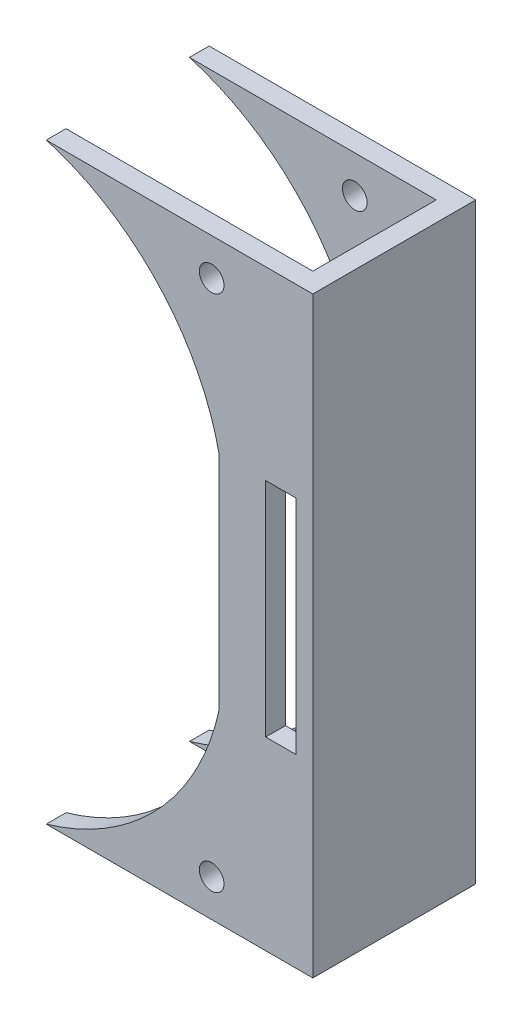
ISO-10303-21;
HEADER;
FILE_DESCRIPTION(('STEP AP214'),'2;1');
FILE_NAME('part.step','',(''),(''),'','','');
FILE_SCHEMA(('AUTOMOTIVE_DESIGN { 1 0 10303 214 1 1 1 1 }'));
ENDSEC;
DATA;
#1=APPLICATION_CONTEXT('core data for automotive mechanical design processes');
#2=APPLICATION_PROTOCOL_DEFINITION('international standard','automotive_design',2000,#1);
#3=PRODUCT_CONTEXT('',#1,'mechanical');
#4=PRODUCT('Part','Part','',(#3));
#5=PRODUCT_RELATED_PRODUCT_CATEGORY('part','',(#4));
#6=PRODUCT_DEFINITION_FORMATION('','',#4);
#7=PRODUCT_DEFINITION_CONTEXT('part definition',#1,'design');
#8=PRODUCT_DEFINITION('design','',#6,#7);
#9=PRODUCT_DEFINITION_SHAPE('','',#8);
#10=(LENGTH_UNIT() NAMED_UNIT(*) SI_UNIT(.MILLI.,.METRE.));
#11=(NAMED_UNIT(*) PLANE_ANGLE_UNIT() SI_UNIT($,.RADIAN.));
#12=(NAMED_UNIT(*) SI_UNIT($,.STERADIAN.) SOLID_ANGLE_UNIT());
#13=UNCERTAINTY_MEASURE_WITH_UNIT(LENGTH_MEASURE(1.E-05),#10,'distance_accuracy_value','');
#14=(GEOMETRIC_REPRESENTATION_CONTEXT(3) GLOBAL_UNCERTAINTY_ASSIGNED_CONTEXT((#13)) GLOBAL_UNIT_ASSIGNED_CONTEXT((#10,
#11,#12)) REPRESENTATION_CONTEXT('',''));
#15=CARTESIAN_POINT('',(0.,0.,0.));
#16=DIRECTION('',(0.,0.,1.));
#17=DIRECTION('',(1.,0.,0.));
#18=AXIS2_PLACEMENT_3D('',#15,#16,#17);
#19=CARTESIAN_POINT('',(27.3357664233577,0.,0.));
#20=DIRECTION('',(1.,0.,0.));
#21=DIRECTION('',(0.,1.,0.));
#22=AXIS2_PLACEMENT_3D('',#19,#20,#21);
#23=PLANE('',#22);
#24=DIRECTION('',(0.,-1.,0.));
#25=VECTOR('',#24,1.);
#26=CARTESIAN_POINT('',(27.3357664233577,0.,0.));
#27=LINE('',#26,#25);
#28=CARTESIAN_POINT('',(27.3357664233577,-22.5,0.));
#29=VERTEX_POINT('',#28);
#30=CARTESIAN_POINT('',(27.3357664233577,-60.,0.));
#31=VERTEX_POINT('',#30);
#32=EDGE_CURVE('E323',#29,#31,#27,.T.);
#33=ORIENTED_EDGE('',*,*,#32,.F.);
#34=DIRECTION('',(0.,0.,-1.));
#35=VECTOR('',#34,1.);
#36=CARTESIAN_POINT('',(27.3357664233577,-22.5,0.));
#37=LINE('',#36,#35);
#38=CARTESIAN_POINT('',(27.3357664233577,-22.5,-25.));
#39=VERTEX_POINT('',#38);
#40=EDGE_CURVE('E223',#29,#39,#37,.T.);
#41=ORIENTED_EDGE('',*,*,#40,.T.);
#42=DIRECTION('',(0.,-1.,0.));
#43=VECTOR('',#42,1.);
#44=CARTESIAN_POINT('',(27.3357664233577,0.,-25.));
#45=LINE('',#44,#43);
#46=CARTESIAN_POINT('',(27.3357664233577,-60.,-25.));
#47=VERTEX_POINT('',#46);
#48=EDGE_CURVE('E262',#39,#47,#45,.T.);
#49=ORIENTED_EDGE('',*,*,#48,.T.);
#50=DIRECTION('',(0.,0.,-1.));
#51=VECTOR('',#50,1.);
#52=CARTESIAN_POINT('',(27.3357664233577,-60.,4.));
#53=LINE('',#52,#51);
#54=EDGE_CURVE('E286',#31,#47,#53,.T.);
#55=ORIENTED_EDGE('',*,*,#54,.F.);
#56=EDGE_LOOP('',(#33,#41,#49,#55));
#57=FACE_BOUND('',#56,.T.);
#58=ADVANCED_FACE('F37',(#57),#23,.F.);
#59=CARTESIAN_POINT('',(27.3357664233576,60.,-25.));
#60=VERTEX_POINT('',#59);
#61=CARTESIAN_POINT('',(27.3357664233576,22.5,-25.));
#62=VERTEX_POINT('',#61);
#63=EDGE_CURVE('E263',#60,#62,#45,.T.);
#64=ORIENTED_EDGE('',*,*,#63,.T.);
#65=DIRECTION('',(0.,0.,1.));
#66=VECTOR('',#65,1.);
#67=CARTESIAN_POINT('',(27.3357664233576,22.5,0.));
#68=LINE('',#67,#66);
#69=CARTESIAN_POINT('',(27.3357664233576,22.5,0.));
#70=VERTEX_POINT('',#69);
#71=EDGE_CURVE('E209',#62,#70,#68,.T.);
#72=ORIENTED_EDGE('',*,*,#71,.T.);
#73=CARTESIAN_POINT('',(27.3357664233576,60.,0.));
#74=VERTEX_POINT('',#73);
#75=EDGE_CURVE('E324',#74,#70,#27,.T.);
#76=ORIENTED_EDGE('',*,*,#75,.F.);
#77=DIRECTION('',(0.,0.,1.));
#78=VECTOR('',#77,1.);
#79=CARTESIAN_POINT('',(27.3357664233576,60.,4.));
#80=LINE('',#79,#78);
#81=EDGE_CURVE('E291',#60,#74,#80,.T.);
#82=ORIENTED_EDGE('',*,*,#81,.F.);
#83=EDGE_LOOP('',(#64,#72,#76,#82));
#84=FACE_BOUND('',#83,.T.);
#85=ADVANCED_FACE('F372',(#84),#23,.F.);
#86=CARTESIAN_POINT('',(0.,-60.,4.));
#87=DIRECTION('',(0.,-1.,0.));
#88=DIRECTION('',(0.,0.,-1.));
#89=AXIS2_PLACEMENT_3D('',#86,#87,#88);
#90=PLANE('',#89);
#91=DIRECTION('',(-1.,0.,0.));
#92=VECTOR('',#91,1.);
#93=CARTESIAN_POINT('',(0.,-60.,0.));
#94=LINE('',#93,#92);
#95=CARTESIAN_POINT('',(-22.6642335766423,-60.,0.));
#96=VERTEX_POINT('',#95);
#97=EDGE_CURVE('E305',#31,#96,#94,.T.);
#98=ORIENTED_EDGE('',*,*,#97,.F.);
#99=ORIENTED_EDGE('',*,*,#54,.T.);
#100=DIRECTION('',(-1.,0.,0.));
#101=VECTOR('',#100,1.);
#102=CARTESIAN_POINT('',(0.,-60.,-25.));
#103=LINE('',#102,#101);
#104=CARTESIAN_POINT('',(-22.6642335766423,-60.,-25.));
#105=VERTEX_POINT('',#104);
#106=EDGE_CURVE('E249',#47,#105,#103,.T.);
#107=ORIENTED_EDGE('',*,*,#106,.T.);
#108=DIRECTION('',(0.,0.,1.));
#109=VECTOR('',#108,1.);
#110=CARTESIAN_POINT('',(-22.6642335766423,-60.,-29.));
#111=LINE('',#110,#109);
#112=CARTESIAN_POINT('',(-22.6642335766423,-60.,-29.));
#113=VERTEX_POINT('',#112);
#114=EDGE_CURVE('E259',#113,#105,#111,.T.);
#115=ORIENTED_EDGE('',*,*,#114,.F.);
#116=DIRECTION('',(-1.,0.,0.));
#117=VECTOR('',#116,1.);
#118=CARTESIAN_POINT('',(31.3357664233577,-60.,-29.));
#119=LINE('',#118,#117);
#120=CARTESIAN_POINT('',(31.3357664233577,-60.,-29.));
#121=VERTEX_POINT('',#120);
#122=EDGE_CURVE('E303',#121,#113,#119,.T.);
#123=ORIENTED_EDGE('',*,*,#122,.F.);
#124=DIRECTION('',(0.,0.,-1.));
#125=VECTOR('',#124,1.);
#126=CARTESIAN_POINT('',(31.3357664233577,-60.,4.));
#127=LINE('',#126,#125);
#128=CARTESIAN_POINT('',(31.3357664233577,-60.,4.));
#129=VERTEX_POINT('',#128);
#130=EDGE_CURVE('E290',#129,#121,#127,.T.);
#131=ORIENTED_EDGE('',*,*,#130,.F.);
#132=DIRECTION('',(-1.,0.,0.));
#133=VECTOR('',#132,1.);
#134=CARTESIAN_POINT('',(0.,-60.,4.));
#135=LINE('',#134,#133);
#136=CARTESIAN_POINT('',(-22.6642335766423,-60.,4.));
#137=VERTEX_POINT('',#136);
#138=EDGE_CURVE('E306',#129,#137,#135,.T.);
#139=ORIENTED_EDGE('',*,*,#138,.T.);
#140=DIRECTION('',(0.,0.,-1.));
#141=VECTOR('',#140,1.);
#142=CARTESIAN_POINT('',(-22.6642335766423,-60.,4.));
#143=LINE('',#142,#141);
#144=EDGE_CURVE('E320',#137,#96,#143,.T.);
#145=ORIENTED_EDGE('',*,*,#144,.T.);
#146=EDGE_LOOP('',(#98,#99,#107,#115,#123,#131,#139,#145));
#147=FACE_BOUND('',#146,.T.);
#148=ADVANCED_FACE('F39',(#147),#90,.T.);
#149=CARTESIAN_POINT('',(0.,60.,4.));
#150=DIRECTION('',(0.,1.,0.));
#151=DIRECTION('',(0.,0.,1.));
#152=AXIS2_PLACEMENT_3D('',#149,#150,#151);
#153=PLANE('',#152);
#154=DIRECTION('',(1.,0.,0.));
#155=VECTOR('',#154,1.);
#156=CARTESIAN_POINT('',(0.,60.,0.));
#157=LINE('',#156,#155);
#158=CARTESIAN_POINT('',(-22.6642335766424,60.,0.));
#159=VERTEX_POINT('',#158);
#160=EDGE_CURVE('E327',#159,#74,#157,.T.);
#161=ORIENTED_EDGE('',*,*,#160,.F.);
#162=DIRECTION('',(0.,0.,-1.));
#163=VECTOR('',#162,1.);
#164=CARTESIAN_POINT('',(-22.6642335766424,60.,4.));
#165=LINE('',#164,#163);
#166=CARTESIAN_POINT('',(-22.6642335766424,60.,4.));
#167=VERTEX_POINT('',#166);
#168=EDGE_CURVE('E343',#167,#159,#165,.T.);
#169=ORIENTED_EDGE('',*,*,#168,.F.);
#170=DIRECTION('',(1.,0.,0.));
#171=VECTOR('',#170,1.);
#172=CARTESIAN_POINT('',(0.,60.,4.));
#173=LINE('',#172,#171);
#174=CARTESIAN_POINT('',(31.3357664233576,60.,4.));
#175=VERTEX_POINT('',#174);
#176=EDGE_CURVE('E309',#167,#175,#173,.T.);
#177=ORIENTED_EDGE('',*,*,#176,.T.);
#178=DIRECTION('',(0.,0.,1.));
#179=VECTOR('',#178,1.);
#180=CARTESIAN_POINT('',(31.3357664233576,60.,4.));
#181=LINE('',#180,#179);
#182=CARTESIAN_POINT('',(31.3357664233576,60.,-29.));
#183=VERTEX_POINT('',#182);
#184=EDGE_CURVE('E295',#183,#175,#181,.T.);
#185=ORIENTED_EDGE('',*,*,#184,.F.);
#186=DIRECTION('',(-1.,0.,0.));
#187=VECTOR('',#186,1.);
#188=CARTESIAN_POINT('',(31.3357664233576,60.,-29.));
#189=LINE('',#188,#187);
#190=CARTESIAN_POINT('',(-22.6642335766424,60.,-29.));
#191=VERTEX_POINT('',#190);
#192=EDGE_CURVE('E298',#183,#191,#189,.T.);
#193=ORIENTED_EDGE('',*,*,#192,.T.);
#194=DIRECTION('',(0.,0.,1.));
#195=VECTOR('',#194,1.);
#196=CARTESIAN_POINT('',(-22.6642335766424,60.,-29.));
#197=LINE('',#196,#195);
#198=CARTESIAN_POINT('',(-22.6642335766424,60.,-25.));
#199=VERTEX_POINT('',#198);
#200=EDGE_CURVE('E283',#191,#199,#197,.T.);
#201=ORIENTED_EDGE('',*,*,#200,.T.);
#202=DIRECTION('',(1.,0.,0.));
#203=VECTOR('',#202,1.);
#204=CARTESIAN_POINT('',(0.,60.,-25.));
#205=LINE('',#204,#203);
#206=EDGE_CURVE('E266',#199,#60,#205,.T.);
#207=ORIENTED_EDGE('',*,*,#206,.T.);
#208=ORIENTED_EDGE('',*,*,#81,.T.);
#209=EDGE_LOOP('',(#161,#169,#177,#185,#193,#201,#207,#208));
#210=FACE_BOUND('',#209,.T.);
#211=ADVANCED_FACE('F376',(#210),#153,.T.);
#212=CARTESIAN_POINT('',(-36.6773985314371,11.8377127088582,4.));
#213=DIRECTION('',(0.,0.,-1.));
#214=DIRECTION('',(-1.,0.,0.));
#215=AXIS2_PLACEMENT_3D('',#212,#213,#214);
#216=CYLINDRICAL_SURFACE('',#215,50.1594927123946);
#217=CARTESIAN_POINT('',(-36.6773985314371,11.8377127088582,0.));
#218=DIRECTION('',(0.,0.,1.));
#219=DIRECTION('',(1.,0.,0.));
#220=AXIS2_PLACEMENT_3D('',#217,#218,#219);
#221=CIRCLE('',#220,50.1594927123946);
#222=CARTESIAN_POINT('',(12.3357664233576,22.5,0.));
#223=VERTEX_POINT('',#222);
#224=EDGE_CURVE('E330',#223,#159,#221,.T.);
#225=ORIENTED_EDGE('',*,*,#224,.F.);
#226=DIRECTION('',(0.,0.,-1.));
#227=VECTOR('',#226,1.);
#228=CARTESIAN_POINT('',(12.3357664233576,22.5,4.));
#229=LINE('',#228,#227);
#230=CARTESIAN_POINT('',(12.3357664233576,22.5,4.));
#231=VERTEX_POINT('',#230);
#232=EDGE_CURVE('E341',#231,#223,#229,.T.);
#233=ORIENTED_EDGE('',*,*,#232,.F.);
#234=CARTESIAN_POINT('',(-36.6773985314371,11.8377127088582,4.));
#235=DIRECTION('',(0.,0.,1.));
#236=DIRECTION('',(1.,0.,0.));
#237=AXIS2_PLACEMENT_3D('',#234,#235,#236);
#238=CIRCLE('',#237,50.1594927123946);
#239=EDGE_CURVE('E312',#231,#167,#238,.T.);
#240=ORIENTED_EDGE('',*,*,#239,.T.);
#241=ORIENTED_EDGE('',*,*,#168,.T.);
#242=EDGE_LOOP('',(#225,#233,#240,#241));
#243=FACE_BOUND('',#242,.T.);
#244=ADVANCED_FACE('F409',(#243),#216,.F.);
#245=CARTESIAN_POINT('',(12.3357664233576,0.,4.));
#246=DIRECTION('',(1.,0.,0.));
#247=DIRECTION('',(0.,1.,0.));
#248=AXIS2_PLACEMENT_3D('',#245,#246,#247);
#249=PLANE('',#248);
#250=DIRECTION('',(0.,-1.,0.));
#251=VECTOR('',#250,1.);
#252=CARTESIAN_POINT('',(12.3357664233576,0.,0.));
#253=LINE('',#252,#251);
#254=CARTESIAN_POINT('',(12.3357664233577,-22.5,0.));
#255=VERTEX_POINT('',#254);
#256=EDGE_CURVE('E333',#223,#255,#253,.T.);
#257=ORIENTED_EDGE('',*,*,#256,.T.);
#258=DIRECTION('',(0.,0.,-1.));
#259=VECTOR('',#258,1.);
#260=CARTESIAN_POINT('',(12.3357664233577,-22.5,4.));
#261=LINE('',#260,#259);
#262=CARTESIAN_POINT('',(12.3357664233577,-22.5,4.));
#263=VERTEX_POINT('',#262);
#264=EDGE_CURVE('E339',#263,#255,#261,.T.);
#265=ORIENTED_EDGE('',*,*,#264,.F.);
#266=DIRECTION('',(0.,-1.,0.));
#267=VECTOR('',#266,1.);
#268=CARTESIAN_POINT('',(12.3357664233576,0.,4.));
#269=LINE('',#268,#267);
#270=EDGE_CURVE('E315',#231,#263,#269,.T.);
#271=ORIENTED_EDGE('',*,*,#270,.F.);
#272=ORIENTED_EDGE('',*,*,#232,.T.);
#273=EDGE_LOOP('',(#257,#265,#271,#272));
#274=FACE_BOUND('',#273,.T.);
#275=ADVANCED_FACE('F406',(#274),#249,.F.);
#276=CARTESIAN_POINT('',(-36.6773985314372,-11.8377127088581,4.));
#277=DIRECTION('',(0.,0.,-1.));
#278=DIRECTION('',(-1.,0.,0.));
#279=AXIS2_PLACEMENT_3D('',#276,#277,#278);
#280=CYLINDRICAL_SURFACE('',#279,50.1594927123947);
#281=CARTESIAN_POINT('',(-36.6773985314372,-11.8377127088581,0.));
#282=DIRECTION('',(0.,0.,1.));
#283=DIRECTION('',(1.,0.,0.));
#284=AXIS2_PLACEMENT_3D('',#281,#282,#283);
#285=CIRCLE('',#284,50.1594927123947);
#286=EDGE_CURVE('E310',#96,#255,#285,.T.);
#287=ORIENTED_EDGE('',*,*,#286,.F.);
#288=ORIENTED_EDGE('',*,*,#144,.F.);
#289=CARTESIAN_POINT('',(-36.6773985314372,-11.8377127088581,4.));
#290=DIRECTION('',(0.,0.,1.));
#291=DIRECTION('',(1.,0.,0.));
#292=AXIS2_PLACEMENT_3D('',#289,#290,#291);
#293=CIRCLE('',#292,50.1594927123947);
#294=EDGE_CURVE('E317',#137,#263,#293,.T.);
#295=ORIENTED_EDGE('',*,*,#294,.T.);
#296=ORIENTED_EDGE('',*,*,#264,.T.);
#297=EDGE_LOOP('',(#287,#288,#295,#296));
#298=FACE_BOUND('',#297,.T.);
#299=ADVANCED_FACE('F401',(#298),#280,.F.);
#300=CARTESIAN_POINT('',(0.,0.,4.));
#301=DIRECTION('',(0.,0.,1.));
#302=DIRECTION('',(1.,0.,0.));
#303=AXIS2_PLACEMENT_3D('',#300,#301,#302);
#304=PLANE('',#303);
#305=DIRECTION('',(0.,1.,0.));
#306=VECTOR('',#305,1.);
#307=CARTESIAN_POINT('',(27.8871736605776,-22.5,4.));
#308=LINE('',#307,#306);
#309=CARTESIAN_POINT('',(27.8871736605776,-22.5,4.));
#310=VERTEX_POINT('',#309);
#311=CARTESIAN_POINT('',(27.8871736605776,22.5,4.));
#312=VERTEX_POINT('',#311);
#313=EDGE_CURVE('E52',#310,#312,#308,.T.);
#314=ORIENTED_EDGE('',*,*,#313,.F.);
#315=DIRECTION('',(1.,0.,0.));
#316=VECTOR('',#315,1.);
#317=CARTESIAN_POINT('',(21.7843591861376,-22.5,4.));
#318=LINE('',#317,#316);
#319=CARTESIAN_POINT('',(21.7843591861376,-22.5,4.));
#320=VERTEX_POINT('',#319);
#321=EDGE_CURVE('E194',#320,#310,#318,.T.);
#322=ORIENTED_EDGE('',*,*,#321,.F.);
#323=DIRECTION('',(0.,-1.,0.));
#324=VECTOR('',#323,1.);
#325=CARTESIAN_POINT('',(21.7843591861376,-22.5,4.));
#326=LINE('',#325,#324);
#327=CARTESIAN_POINT('',(21.7843591861376,22.5,4.));
#328=VERTEX_POINT('',#327);
#329=EDGE_CURVE('E197',#328,#320,#326,.T.);
#330=ORIENTED_EDGE('',*,*,#329,.F.);
#331=DIRECTION('',(-1.,0.,0.));
#332=VECTOR('',#331,1.);
#333=CARTESIAN_POINT('',(21.7843591861376,22.5,4.));
#334=LINE('',#333,#332);
#335=EDGE_CURVE('E203',#312,#328,#334,.T.);
#336=ORIENTED_EDGE('',*,*,#335,.F.);
#337=EDGE_LOOP('',(#314,#322,#330,#336));
#338=FACE_BOUND('',#337,.T.);
#339=CARTESIAN_POINT('',(10.8357664233576,-52.5,4.));
#340=DIRECTION('',(0.,0.,-1.));
#341=DIRECTION('',(1.,0.,0.));
#342=AXIS2_PLACEMENT_3D('',#339,#340,#341);
#343=CIRCLE('',#342,2.5);
#344=CARTESIAN_POINT('',(13.3357664233576,-52.5,4.));
#345=VERTEX_POINT('',#344);
#346=EDGE_CURVE('E229',#345,#345,#343,.T.);
#347=ORIENTED_EDGE('',*,*,#346,.T.);
#348=EDGE_LOOP('',(#347));
#349=FACE_BOUND('',#348,.T.);
#350=CARTESIAN_POINT('',(10.8357664233576,52.5,4.));
#351=DIRECTION('',(0.,0.,1.));
#352=DIRECTION('',(1.,0.,0.));
#353=AXIS2_PLACEMENT_3D('',#350,#351,#352);
#354=CIRCLE('',#353,2.5);
#355=CARTESIAN_POINT('',(13.3357664233576,52.5,4.));
#356=VERTEX_POINT('',#355);
#357=EDGE_CURVE('E239',#356,#356,#354,.T.);
#358=ORIENTED_EDGE('',*,*,#357,.F.);
#359=EDGE_LOOP('',(#358));
#360=FACE_BOUND('',#359,.T.);
#361=ORIENTED_EDGE('',*,*,#138,.F.);
#362=DIRECTION('',(0.,-1.,0.));
#363=VECTOR('',#362,1.);
#364=CARTESIAN_POINT('',(31.3357664233576,60.,4.));
#365=LINE('',#364,#363);
#366=EDGE_CURVE('E287',#175,#129,#365,.T.);
#367=ORIENTED_EDGE('',*,*,#366,.F.);
#368=ORIENTED_EDGE('',*,*,#176,.F.);
#369=ORIENTED_EDGE('',*,*,#239,.F.);
#370=ORIENTED_EDGE('',*,*,#270,.T.);
#371=ORIENTED_EDGE('',*,*,#294,.F.);
#372=EDGE_LOOP('',(#361,#367,#368,#369,#370,#371));
#373=FACE_BOUND('',#372,.T.);
#374=ADVANCED_FACE('F363',(#338,#349,#360,#373),#304,.T.);
#375=CARTESIAN_POINT('',(0.,0.,0.));
#376=DIRECTION('',(0.,0.,1.));
#377=DIRECTION('',(1.,0.,0.));
#378=AXIS2_PLACEMENT_3D('',#375,#376,#377);
#379=PLANE('',#378);
#380=CARTESIAN_POINT('',(10.8357664233576,-52.5,0.));
#381=DIRECTION('',(0.,0.,1.));
#382=DIRECTION('',(1.,0.,0.));
#383=AXIS2_PLACEMENT_3D('',#380,#381,#382);
#384=CIRCLE('',#383,2.5);
#385=CARTESIAN_POINT('',(13.3357664233576,-52.5,0.));
#386=VERTEX_POINT('',#385);
#387=EDGE_CURVE('E236',#386,#386,#384,.F.);
#388=ORIENTED_EDGE('',*,*,#387,.F.);
#389=EDGE_LOOP('',(#388));
#390=FACE_BOUND('',#389,.T.);
#391=CARTESIAN_POINT('',(10.8357664233576,52.5,0.));
#392=DIRECTION('',(0.,0.,1.));
#393=DIRECTION('',(1.,0.,0.));
#394=AXIS2_PLACEMENT_3D('',#391,#392,#393);
#395=CIRCLE('',#394,2.5);
#396=CARTESIAN_POINT('',(13.3357664233576,52.5,0.));
#397=VERTEX_POINT('',#396);
#398=EDGE_CURVE('E246',#397,#397,#395,.T.);
#399=ORIENTED_EDGE('',*,*,#398,.T.);
#400=EDGE_LOOP('',(#399));
#401=FACE_BOUND('',#400,.T.);
#402=DIRECTION('',(0.,-1.,0.));
#403=VECTOR('',#402,1.);
#404=CARTESIAN_POINT('',(21.7843591861376,0.,0.));
#405=LINE('',#404,#403);
#406=CARTESIAN_POINT('',(21.7843591861376,22.5,0.));
#407=VERTEX_POINT('',#406);
#408=CARTESIAN_POINT('',(21.7843591861376,-22.5,0.));
#409=VERTEX_POINT('',#408);
#410=EDGE_CURVE('E220',#407,#409,#405,.T.);
#411=ORIENTED_EDGE('',*,*,#410,.T.);
#412=DIRECTION('',(1.,0.,0.));
#413=VECTOR('',#412,1.);
#414=CARTESIAN_POINT('',(0.,-22.5,0.));
#415=LINE('',#414,#413);
#416=EDGE_CURVE('E226',#409,#29,#415,.T.);
#417=ORIENTED_EDGE('',*,*,#416,.T.);
#418=ORIENTED_EDGE('',*,*,#32,.T.);
#419=ORIENTED_EDGE('',*,*,#97,.T.);
#420=ORIENTED_EDGE('',*,*,#286,.T.);
#421=ORIENTED_EDGE('',*,*,#256,.F.);
#422=ORIENTED_EDGE('',*,*,#224,.T.);
#423=ORIENTED_EDGE('',*,*,#160,.T.);
#424=ORIENTED_EDGE('',*,*,#75,.T.);
#425=DIRECTION('',(-1.,0.,0.));
#426=VECTOR('',#425,1.);
#427=CARTESIAN_POINT('',(0.,22.5,0.));
#428=LINE('',#427,#426);
#429=EDGE_CURVE('E217',#70,#407,#428,.T.);
#430=ORIENTED_EDGE('',*,*,#429,.T.);
#431=EDGE_LOOP('',(#411,#417,#418,#419,#420,#421,#422,#423,#424,#430));
#432=FACE_BOUND('',#431,.T.);
#433=ADVANCED_FACE('F368',(#390,#401,#432),#379,.F.);
#434=CARTESIAN_POINT('',(31.3357664233576,60.,-29.));
#435=DIRECTION('',(0.,0.,1.));
#436=DIRECTION('',(0.,-1.,0.));
#437=AXIS2_PLACEMENT_3D('',#434,#435,#436);
#438=PLANE('',#437);
#439=DIRECTION('',(1.,0.,0.));
#440=VECTOR('',#439,1.);
#441=CARTESIAN_POINT('',(21.7843591861376,-22.5,-29.));
#442=LINE('',#441,#440);
#443=CARTESIAN_POINT('',(21.7843591861376,-22.5,-29.));
#444=VERTEX_POINT('',#443);
#445=CARTESIAN_POINT('',(27.8871736605776,-22.5,-29.));
#446=VERTEX_POINT('',#445);
#447=EDGE_CURVE('E183',#444,#446,#442,.T.);
#448=ORIENTED_EDGE('',*,*,#447,.T.);
#449=DIRECTION('',(0.,1.,0.));
#450=VECTOR('',#449,1.);
#451=CARTESIAN_POINT('',(27.8871736605776,-22.5,-29.));
#452=LINE('',#451,#450);
#453=CARTESIAN_POINT('',(27.8871736605776,22.5,-29.));
#454=VERTEX_POINT('',#453);
#455=EDGE_CURVE('E177',#446,#454,#452,.T.);
#456=ORIENTED_EDGE('',*,*,#455,.T.);
#457=DIRECTION('',(-1.,0.,0.));
#458=VECTOR('',#457,1.);
#459=CARTESIAN_POINT('',(21.7843591861376,22.5,-29.));
#460=LINE('',#459,#458);
#461=CARTESIAN_POINT('',(21.7843591861376,22.5,-29.));
#462=VERTEX_POINT('',#461);
#463=EDGE_CURVE('E186',#454,#462,#460,.T.);
#464=ORIENTED_EDGE('',*,*,#463,.T.);
#465=DIRECTION('',(0.,-1.,0.));
#466=VECTOR('',#465,1.);
#467=CARTESIAN_POINT('',(21.7843591861376,-22.5,-29.));
#468=LINE('',#467,#466);
#469=EDGE_CURVE('E60',#462,#444,#468,.T.);
#470=ORIENTED_EDGE('',*,*,#469,.T.);
#471=EDGE_LOOP('',(#448,#456,#464,#470));
#472=FACE_BOUND('',#471,.T.);
#473=CARTESIAN_POINT('',(10.8357664233576,-52.5,-29.));
#474=DIRECTION('',(0.,0.,-1.));
#475=DIRECTION('',(1.,0.,0.));
#476=AXIS2_PLACEMENT_3D('',#473,#474,#475);
#477=CIRCLE('',#476,2.5);
#478=CARTESIAN_POINT('',(13.3357664233576,-52.5,-29.));
#479=VERTEX_POINT('',#478);
#480=EDGE_CURVE('E230',#479,#479,#477,.T.);
#481=ORIENTED_EDGE('',*,*,#480,.F.);
#482=EDGE_LOOP('',(#481));
#483=FACE_BOUND('',#482,.T.);
#484=CARTESIAN_POINT('',(10.8357664233576,52.5,-29.));
#485=DIRECTION('',(0.,0.,1.));
#486=DIRECTION('',(1.,0.,0.));
#487=AXIS2_PLACEMENT_3D('',#484,#485,#486);
#488=CIRCLE('',#487,2.5);
#489=CARTESIAN_POINT('',(13.3357664233576,52.5,-29.));
#490=VERTEX_POINT('',#489);
#491=EDGE_CURVE('E240',#490,#490,#488,.T.);
#492=ORIENTED_EDGE('',*,*,#491,.T.);
#493=EDGE_LOOP('',(#492));
#494=FACE_BOUND('',#493,.T.);
#495=ORIENTED_EDGE('',*,*,#122,.T.);
#496=CARTESIAN_POINT('',(-36.6773985314372,-11.8377127088581,-29.));
#497=DIRECTION('',(0.,0.,1.));
#498=DIRECTION('',(1.,0.,0.));
#499=AXIS2_PLACEMENT_3D('',#496,#497,#498);
#500=CIRCLE('',#499,50.1594927123947);
#501=CARTESIAN_POINT('',(12.3357664233577,-22.5,-29.));
#502=VERTEX_POINT('',#501);
#503=EDGE_CURVE('E257',#113,#502,#500,.T.);
#504=ORIENTED_EDGE('',*,*,#503,.T.);
#505=DIRECTION('',(0.,-1.,0.));
#506=VECTOR('',#505,1.);
#507=CARTESIAN_POINT('',(12.3357664233576,0.,-29.));
#508=LINE('',#507,#506);
#509=CARTESIAN_POINT('',(12.3357664233576,22.5,-29.));
#510=VERTEX_POINT('',#509);
#511=EDGE_CURVE('E253',#510,#502,#508,.T.);
#512=ORIENTED_EDGE('',*,*,#511,.F.);
#513=CARTESIAN_POINT('',(-36.6773985314371,11.8377127088582,-29.));
#514=DIRECTION('',(0.,0.,1.));
#515=DIRECTION('',(1.,0.,0.));
#516=AXIS2_PLACEMENT_3D('',#513,#514,#515);
#517=CIRCLE('',#516,50.1594927123946);
#518=EDGE_CURVE('E250',#510,#191,#517,.T.);
#519=ORIENTED_EDGE('',*,*,#518,.T.);
#520=ORIENTED_EDGE('',*,*,#192,.F.);
#521=DIRECTION('',(0.,1.,0.));
#522=VECTOR('',#521,1.);
#523=CARTESIAN_POINT('',(31.3357664233576,60.,-29.));
#524=LINE('',#523,#522);
#525=EDGE_CURVE('E293',#121,#183,#524,.T.);
#526=ORIENTED_EDGE('',*,*,#525,.F.);
#527=EDGE_LOOP('',(#495,#504,#512,#519,#520,#526));
#528=FACE_BOUND('',#527,.T.);
#529=ADVANCED_FACE('F191',(#472,#483,#494,#528),#438,.F.);
#530=CARTESIAN_POINT('',(31.3357664233577,0.,0.));
#531=DIRECTION('',(1.,0.,0.));
#532=DIRECTION('',(0.,1.,0.));
#533=AXIS2_PLACEMENT_3D('',#530,#531,#532);
#534=PLANE('',#533);
#535=ORIENTED_EDGE('',*,*,#366,.T.);
#536=ORIENTED_EDGE('',*,*,#130,.T.);
#537=ORIENTED_EDGE('',*,*,#525,.T.);
#538=ORIENTED_EDGE('',*,*,#184,.T.);
#539=EDGE_LOOP('',(#535,#536,#537,#538));
#540=FACE_BOUND('',#539,.T.);
#541=ADVANCED_FACE('F416',(#540),#534,.T.);
#542=CARTESIAN_POINT('',(-36.6773985314371,11.8377127088582,-29.));
#543=DIRECTION('',(0.,0.,1.));
#544=DIRECTION('',(-1.,0.,0.));
#545=AXIS2_PLACEMENT_3D('',#542,#543,#544);
#546=CYLINDRICAL_SURFACE('',#545,50.1594927123946);
#547=CARTESIAN_POINT('',(-36.6773985314371,11.8377127088582,-25.));
#548=DIRECTION('',(0.,0.,1.));
#549=DIRECTION('',(1.,0.,0.));
#550=AXIS2_PLACEMENT_3D('',#547,#548,#549);
#551=CIRCLE('',#550,50.1594927123946);
#552=CARTESIAN_POINT('',(12.3357664233576,22.5,-25.));
#553=VERTEX_POINT('',#552);
#554=EDGE_CURVE('E269',#553,#199,#551,.T.);
#555=ORIENTED_EDGE('',*,*,#554,.T.);
#556=ORIENTED_EDGE('',*,*,#200,.F.);
#557=ORIENTED_EDGE('',*,*,#518,.F.);
#558=DIRECTION('',(0.,0.,1.));
#559=VECTOR('',#558,1.);
#560=CARTESIAN_POINT('',(12.3357664233576,22.5,-29.));
#561=LINE('',#560,#559);
#562=EDGE_CURVE('E280',#510,#553,#561,.T.);
#563=ORIENTED_EDGE('',*,*,#562,.T.);
#564=EDGE_LOOP('',(#555,#556,#557,#563));
#565=FACE_BOUND('',#564,.T.);
#566=ADVANCED_FACE('F382',(#565),#546,.F.);
#567=CARTESIAN_POINT('',(12.3357664233576,0.,-29.));
#568=DIRECTION('',(1.,0.,0.));
#569=DIRECTION('',(0.,1.,0.));
#570=AXIS2_PLACEMENT_3D('',#567,#568,#569);
#571=PLANE('',#570);
#572=DIRECTION('',(0.,-1.,0.));
#573=VECTOR('',#572,1.);
#574=CARTESIAN_POINT('',(12.3357664233576,0.,-25.));
#575=LINE('',#574,#573);
#576=CARTESIAN_POINT('',(12.3357664233577,-22.5,-25.));
#577=VERTEX_POINT('',#576);
#578=EDGE_CURVE('E271',#553,#577,#575,.T.);
#579=ORIENTED_EDGE('',*,*,#578,.F.);
#580=ORIENTED_EDGE('',*,*,#562,.F.);
#581=ORIENTED_EDGE('',*,*,#511,.T.);
#582=DIRECTION('',(0.,0.,1.));
#583=VECTOR('',#582,1.);
#584=CARTESIAN_POINT('',(12.3357664233577,-22.5,-29.));
#585=LINE('',#584,#583);
#586=EDGE_CURVE('E277',#502,#577,#585,.T.);
#587=ORIENTED_EDGE('',*,*,#586,.T.);
#588=EDGE_LOOP('',(#579,#580,#581,#587));
#589=FACE_BOUND('',#588,.T.);
#590=ADVANCED_FACE('F385',(#589),#571,.F.);
#591=CARTESIAN_POINT('',(-36.6773985314372,-11.8377127088581,-29.));
#592=DIRECTION('',(0.,0.,1.));
#593=DIRECTION('',(-1.,0.,0.));
#594=AXIS2_PLACEMENT_3D('',#591,#592,#593);
#595=CYLINDRICAL_SURFACE('',#594,50.1594927123947);
#596=CARTESIAN_POINT('',(-36.6773985314372,-11.8377127088581,-25.));
#597=DIRECTION('',(0.,0.,1.));
#598=DIRECTION('',(1.,0.,0.));
#599=AXIS2_PLACEMENT_3D('',#596,#597,#598);
#600=CIRCLE('',#599,50.1594927123947);
#601=EDGE_CURVE('E254',#105,#577,#600,.T.);
#602=ORIENTED_EDGE('',*,*,#601,.T.);
#603=ORIENTED_EDGE('',*,*,#586,.F.);
#604=ORIENTED_EDGE('',*,*,#503,.F.);
#605=ORIENTED_EDGE('',*,*,#114,.T.);
#606=EDGE_LOOP('',(#602,#603,#604,#605));
#607=FACE_BOUND('',#606,.T.);
#608=ADVANCED_FACE('F391',(#607),#595,.F.);
#609=CARTESIAN_POINT('',(0.,0.,-25.));
#610=DIRECTION('',(0.,0.,-1.));
#611=DIRECTION('',(1.,0.,0.));
#612=AXIS2_PLACEMENT_3D('',#609,#610,#611);
#613=PLANE('',#612);
#614=CARTESIAN_POINT('',(10.8357664233576,-52.5,-25.));
#615=DIRECTION('',(0.,0.,-1.));
#616=DIRECTION('',(-1.,0.,0.));
#617=AXIS2_PLACEMENT_3D('',#614,#615,#616);
#618=CIRCLE('',#617,2.5);
#619=CARTESIAN_POINT('',(8.33576642335764,-52.5,-25.));
#620=VERTEX_POINT('',#619);
#621=EDGE_CURVE('E233',#620,#620,#618,.F.);
#622=ORIENTED_EDGE('',*,*,#621,.F.);
#623=EDGE_LOOP('',(#622));
#624=FACE_BOUND('',#623,.T.);
#625=CARTESIAN_POINT('',(10.8357664233576,52.5,-25.));
#626=DIRECTION('',(0.,0.,-1.));
#627=DIRECTION('',(-1.,0.,0.));
#628=AXIS2_PLACEMENT_3D('',#625,#626,#627);
#629=CIRCLE('',#628,2.5);
#630=CARTESIAN_POINT('',(8.33576642335764,52.5,-25.));
#631=VERTEX_POINT('',#630);
#632=EDGE_CURVE('E243',#631,#631,#629,.T.);
#633=ORIENTED_EDGE('',*,*,#632,.T.);
#634=EDGE_LOOP('',(#633));
#635=FACE_BOUND('',#634,.T.);
#636=ORIENTED_EDGE('',*,*,#48,.F.);
#637=DIRECTION('',(-1.,0.,0.));
#638=VECTOR('',#637,1.);
#639=CARTESIAN_POINT('',(0.,-22.5,-25.));
#640=LINE('',#639,#638);
#641=CARTESIAN_POINT('',(21.7843591861376,-22.5,-25.));
#642=VERTEX_POINT('',#641);
#643=EDGE_CURVE('E11',#39,#642,#640,.T.);
#644=ORIENTED_EDGE('',*,*,#643,.T.);
#645=DIRECTION('',(0.,1.,0.));
#646=VECTOR('',#645,1.);
#647=CARTESIAN_POINT('',(21.7843591861376,0.,-25.));
#648=LINE('',#647,#646);
#649=CARTESIAN_POINT('',(21.7843591861376,22.5,-25.));
#650=VERTEX_POINT('',#649);
#651=EDGE_CURVE('E45',#642,#650,#648,.T.);
#652=ORIENTED_EDGE('',*,*,#651,.T.);
#653=DIRECTION('',(1.,0.,0.));
#654=VECTOR('',#653,1.);
#655=CARTESIAN_POINT('',(0.,22.5,-25.));
#656=LINE('',#655,#654);
#657=EDGE_CURVE('E345',#650,#62,#656,.T.);
#658=ORIENTED_EDGE('',*,*,#657,.T.);
#659=ORIENTED_EDGE('',*,*,#63,.F.);
#660=ORIENTED_EDGE('',*,*,#206,.F.);
#661=ORIENTED_EDGE('',*,*,#554,.F.);
#662=ORIENTED_EDGE('',*,*,#578,.T.);
#663=ORIENTED_EDGE('',*,*,#601,.F.);
#664=ORIENTED_EDGE('',*,*,#106,.F.);
#665=EDGE_LOOP('',(#636,#644,#652,#658,#659,#660,#661,#662,#663,#664));
#666=FACE_BOUND('',#665,.T.);
#667=ADVANCED_FACE('F354',(#624,#635,#666),#613,.F.);
#668=CARTESIAN_POINT('',(10.8357664233576,52.5,-29.));
#669=DIRECTION('',(0.,0.,1.));
#670=DIRECTION('',(1.,0.,0.));
#671=AXIS2_PLACEMENT_3D('',#668,#669,#670);
#672=CYLINDRICAL_SURFACE('',#671,2.5);
#673=ORIENTED_EDGE('',*,*,#491,.F.);
#674=EDGE_LOOP('',(#673));
#675=FACE_BOUND('',#674,.T.);
#676=ORIENTED_EDGE('',*,*,#632,.F.);
#677=EDGE_LOOP('',(#676));
#678=FACE_BOUND('',#677,.T.);
#679=ADVANCED_FACE('F443',(#675,#678),#672,.F.);
#680=ORIENTED_EDGE('',*,*,#357,.T.);
#681=EDGE_LOOP('',(#680));
#682=FACE_BOUND('',#681,.T.);
#683=ORIENTED_EDGE('',*,*,#398,.F.);
#684=EDGE_LOOP('',(#683));
#685=FACE_BOUND('',#684,.T.);
#686=ADVANCED_FACE('F445',(#682,#685),#672,.F.);
#687=CARTESIAN_POINT('',(10.8357664233576,-52.5,-29.));
#688=DIRECTION('',(0.,0.,1.));
#689=DIRECTION('',(1.,0.,0.));
#690=AXIS2_PLACEMENT_3D('',#687,#688,#689);
#691=CYLINDRICAL_SURFACE('',#690,2.5);
#692=ORIENTED_EDGE('',*,*,#480,.T.);
#693=EDGE_LOOP('',(#692));
#694=FACE_BOUND('',#693,.T.);
#695=ORIENTED_EDGE('',*,*,#621,.T.);
#696=EDGE_LOOP('',(#695));
#697=FACE_BOUND('',#696,.T.);
#698=ADVANCED_FACE('F448',(#694,#697),#691,.F.);
#699=ORIENTED_EDGE('',*,*,#346,.F.);
#700=EDGE_LOOP('',(#699));
#701=FACE_BOUND('',#700,.T.);
#702=ORIENTED_EDGE('',*,*,#387,.T.);
#703=EDGE_LOOP('',(#702));
#704=FACE_BOUND('',#703,.T.);
#705=ADVANCED_FACE('F450',(#701,#704),#691,.F.);
#706=CARTESIAN_POINT('',(21.7843591861376,-22.5,-29.));
#707=DIRECTION('',(0.,-1.,0.));
#708=DIRECTION('',(0.,0.,-1.));
#709=AXIS2_PLACEMENT_3D('',#706,#707,#708);
#710=PLANE('',#709);
#711=DIRECTION('',(0.,0.,1.));
#712=VECTOR('',#711,1.);
#713=CARTESIAN_POINT('',(21.7843591861376,-22.5,-29.));
#714=LINE('',#713,#712);
#715=EDGE_CURVE('E213',#409,#320,#714,.T.);
#716=ORIENTED_EDGE('',*,*,#715,.T.);
#717=ORIENTED_EDGE('',*,*,#321,.T.);
#718=DIRECTION('',(0.,0.,1.));
#719=VECTOR('',#718,1.);
#720=CARTESIAN_POINT('',(27.8871736605776,-22.5,-29.));
#721=LINE('',#720,#719);
#722=EDGE_CURVE('E207',#446,#310,#721,.T.);
#723=ORIENTED_EDGE('',*,*,#722,.F.);
#724=ORIENTED_EDGE('',*,*,#447,.F.);
#725=EDGE_CURVE('E210',#444,#642,#714,.T.);
#726=ORIENTED_EDGE('',*,*,#725,.T.);
#727=ORIENTED_EDGE('',*,*,#643,.F.);
#728=ORIENTED_EDGE('',*,*,#40,.F.);
#729=ORIENTED_EDGE('',*,*,#416,.F.);
#730=EDGE_LOOP('',(#716,#717,#723,#724,#726,#727,#728,#729));
#731=FACE_BOUND('',#730,.T.);
#732=ADVANCED_FACE('F358',(#731),#710,.F.);
#733=CARTESIAN_POINT('',(21.7843591861376,-22.5,-29.));
#734=DIRECTION('',(-1.,0.,0.));
#735=DIRECTION('',(0.,0.,1.));
#736=AXIS2_PLACEMENT_3D('',#733,#734,#735);
#737=PLANE('',#736);
#738=DIRECTION('',(0.,0.,1.));
#739=VECTOR('',#738,1.);
#740=CARTESIAN_POINT('',(21.7843591861376,22.5,-29.));
#741=LINE('',#740,#739);
#742=EDGE_CURVE('E182',#407,#328,#741,.T.);
#743=ORIENTED_EDGE('',*,*,#742,.T.);
#744=ORIENTED_EDGE('',*,*,#329,.T.);
#745=ORIENTED_EDGE('',*,*,#715,.F.);
#746=ORIENTED_EDGE('',*,*,#410,.F.);
#747=EDGE_LOOP('',(#743,#744,#745,#746));
#748=FACE_BOUND('',#747,.T.);
#749=ADVANCED_FACE('F458',(#748),#737,.F.);
#750=ORIENTED_EDGE('',*,*,#725,.F.);
#751=ORIENTED_EDGE('',*,*,#469,.F.);
#752=EDGE_CURVE('E188',#462,#650,#741,.T.);
#753=ORIENTED_EDGE('',*,*,#752,.T.);
#754=ORIENTED_EDGE('',*,*,#651,.F.);
#755=EDGE_LOOP('',(#750,#751,#753,#754));
#756=FACE_BOUND('',#755,.T.);
#757=ADVANCED_FACE('F356',(#756),#737,.F.);
#758=CARTESIAN_POINT('',(21.7843591861376,22.5,-29.));
#759=DIRECTION('',(0.,1.,0.));
#760=DIRECTION('',(0.,0.,1.));
#761=AXIS2_PLACEMENT_3D('',#758,#759,#760);
#762=PLANE('',#761);
#763=ORIENTED_EDGE('',*,*,#71,.F.);
#764=ORIENTED_EDGE('',*,*,#657,.F.);
#765=ORIENTED_EDGE('',*,*,#752,.F.);
#766=ORIENTED_EDGE('',*,*,#463,.F.);
#767=DIRECTION('',(0.,0.,1.));
#768=VECTOR('',#767,1.);
#769=CARTESIAN_POINT('',(27.8871736605776,22.5,-29.));
#770=LINE('',#769,#768);
#771=EDGE_CURVE('E173',#454,#312,#770,.T.);
#772=ORIENTED_EDGE('',*,*,#771,.T.);
#773=ORIENTED_EDGE('',*,*,#335,.T.);
#774=ORIENTED_EDGE('',*,*,#742,.F.);
#775=ORIENTED_EDGE('',*,*,#429,.F.);
#776=EDGE_LOOP('',(#763,#764,#765,#766,#772,#773,#774,#775));
#777=FACE_BOUND('',#776,.T.);
#778=ADVANCED_FACE('F187',(#777),#762,.F.);
#779=CARTESIAN_POINT('',(27.8871736605776,-22.5,-29.));
#780=DIRECTION('',(1.,0.,0.));
#781=DIRECTION('',(0.,0.,-1.));
#782=AXIS2_PLACEMENT_3D('',#779,#780,#781);
#783=PLANE('',#782);
#784=ORIENTED_EDGE('',*,*,#313,.T.);
#785=ORIENTED_EDGE('',*,*,#771,.F.);
#786=ORIENTED_EDGE('',*,*,#455,.F.);
#787=ORIENTED_EDGE('',*,*,#722,.T.);
#788=EDGE_LOOP('',(#784,#785,#786,#787));
#789=FACE_BOUND('',#788,.T.);
#790=ADVANCED_FACE('F175',(#789),#783,.F.);
#791=CLOSED_SHELL('',(#58,#85,#148,#211,#244,#275,#299,#374,#433,#529,#541,#566,#590,#608,#667,
#679,#686,#698,#705,#732,#749,#757,#778,#790));
#792=MANIFOLD_SOLID_BREP('B2',#791);
#793=ADVANCED_BREP_SHAPE_REPRESENTATION('',(#18,#792),#14);
#794=SHAPE_DEFINITION_REPRESENTATION(#9,#793);
ENDSEC;
END-ISO-10303-21;
